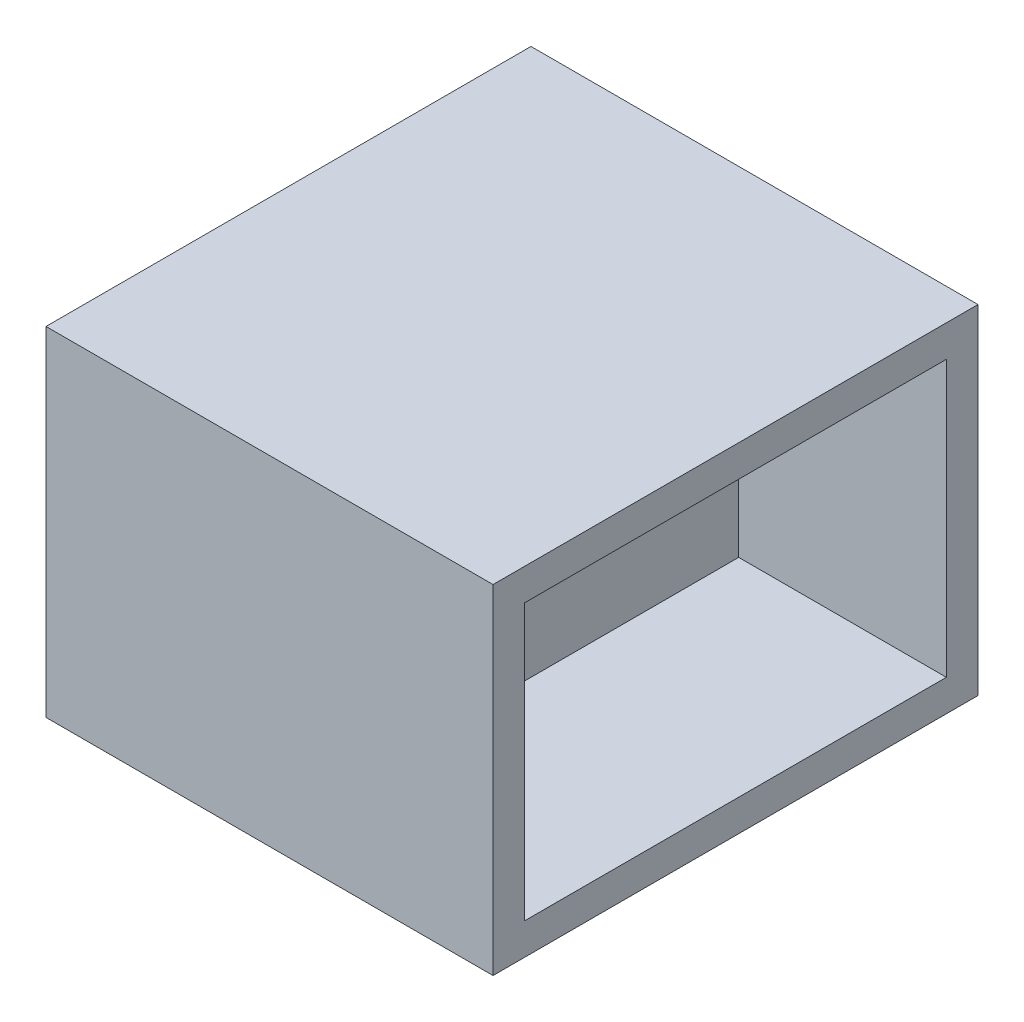
ISO-10303-21;
HEADER;
FILE_DESCRIPTION(('STEP AP214'),'2;1');
FILE_NAME('part.step','',(''),(''),'','','');
FILE_SCHEMA(('AUTOMOTIVE_DESIGN { 1 0 10303 214 1 1 1 1 }'));
ENDSEC;
DATA;
#1=APPLICATION_CONTEXT('core data for automotive mechanical design processes');
#2=APPLICATION_PROTOCOL_DEFINITION('international standard','automotive_design',2000,#1);
#3=PRODUCT_CONTEXT('',#1,'mechanical');
#4=PRODUCT('Part','Part','',(#3));
#5=PRODUCT_RELATED_PRODUCT_CATEGORY('part','',(#4));
#6=PRODUCT_DEFINITION_FORMATION('','',#4);
#7=PRODUCT_DEFINITION_CONTEXT('part definition',#1,'design');
#8=PRODUCT_DEFINITION('design','',#6,#7);
#9=PRODUCT_DEFINITION_SHAPE('','',#8);
#10=(LENGTH_UNIT() NAMED_UNIT(*) SI_UNIT(.MILLI.,.METRE.));
#11=(NAMED_UNIT(*) PLANE_ANGLE_UNIT() SI_UNIT($,.RADIAN.));
#12=(NAMED_UNIT(*) SI_UNIT($,.STERADIAN.) SOLID_ANGLE_UNIT());
#13=UNCERTAINTY_MEASURE_WITH_UNIT(LENGTH_MEASURE(1.E-05),#10,'distance_accuracy_value','');
#14=(GEOMETRIC_REPRESENTATION_CONTEXT(3) GLOBAL_UNCERTAINTY_ASSIGNED_CONTEXT((#13)) GLOBAL_UNIT_ASSIGNED_CONTEXT((#10,
#11,#12)) REPRESENTATION_CONTEXT('',''));
#15=CARTESIAN_POINT('',(0.,0.,0.));
#16=DIRECTION('',(0.,0.,1.));
#17=DIRECTION('',(1.,0.,0.));
#18=AXIS2_PLACEMENT_3D('',#15,#16,#17);
#19=CARTESIAN_POINT('',(0.,0.,3.));
#20=DIRECTION('',(0.,0.,-1.));
#21=DIRECTION('',(-1.,0.,0.));
#22=AXIS2_PLACEMENT_3D('',#19,#20,#21);
#23=PLANE('',#22);
#24=DIRECTION('',(0.,-1.,0.));
#25=VECTOR('',#24,1.);
#26=CARTESIAN_POINT('',(-21.2,-16.06,3.));
#27=LINE('',#26,#25);
#28=CARTESIAN_POINT('',(-21.2,13.06,3.));
#29=VERTEX_POINT('',#28);
#30=CARTESIAN_POINT('',(-21.2,-13.06,3.));
#31=VERTEX_POINT('',#30);
#32=EDGE_CURVE('E214',#29,#31,#27,.T.);
#33=ORIENTED_EDGE('',*,*,#32,.T.);
#34=DIRECTION('',(1.,0.,0.));
#35=VECTOR('',#34,1.);
#36=CARTESIAN_POINT('',(-21.2,-13.06,3.));
#37=LINE('',#36,#35);
#38=CARTESIAN_POINT('',(-1.5,-13.06,3.));
#39=VERTEX_POINT('',#38);
#40=EDGE_CURVE('E54',#31,#39,#37,.T.);
#41=ORIENTED_EDGE('',*,*,#40,.T.);
#42=DIRECTION('',(0.,1.,0.));
#43=VECTOR('',#42,1.);
#44=CARTESIAN_POINT('',(-1.5,0.,3.));
#45=LINE('',#44,#43);
#46=CARTESIAN_POINT('',(-1.5,13.06,3.));
#47=VERTEX_POINT('',#46);
#48=EDGE_CURVE('E58',#39,#47,#45,.T.);
#49=ORIENTED_EDGE('',*,*,#48,.T.);
#50=DIRECTION('',(1.,0.,0.));
#51=VECTOR('',#50,1.);
#52=CARTESIAN_POINT('',(0.,13.06,3.));
#53=LINE('',#52,#51);
#54=EDGE_CURVE('E181',#29,#47,#53,.T.);
#55=ORIENTED_EDGE('',*,*,#54,.F.);
#56=EDGE_LOOP('',(#33,#41,#49,#55));
#57=FACE_BOUND('',#56,.T.);
#58=ADVANCED_FACE('F37',(#57),#23,.F.);
#59=CARTESIAN_POINT('',(21.2,-16.06,3.));
#60=DIRECTION('',(-1.,0.,0.));
#61=DIRECTION('',(0.,0.,1.));
#62=AXIS2_PLACEMENT_3D('',#59,#60,#61);
#63=PLANE('',#62);
#64=DIRECTION('',(0.,0.,-1.));
#65=VECTOR('',#64,1.);
#66=CARTESIAN_POINT('',(21.2,-13.06,43.));
#67=LINE('',#66,#65);
#68=CARTESIAN_POINT('',(21.2,-13.06,43.));
#69=VERTEX_POINT('',#68);
#70=CARTESIAN_POINT('',(21.2,-13.06,3.));
#71=VERTEX_POINT('',#70);
#72=EDGE_CURVE('E178',#69,#71,#67,.T.);
#73=ORIENTED_EDGE('',*,*,#72,.F.);
#74=DIRECTION('',(0.,1.,0.));
#75=VECTOR('',#74,1.);
#76=CARTESIAN_POINT('',(21.2,-16.06,43.));
#77=LINE('',#76,#75);
#78=CARTESIAN_POINT('',(21.2,13.06,43.));
#79=VERTEX_POINT('',#78);
#80=EDGE_CURVE('E153',#69,#79,#77,.T.);
#81=ORIENTED_EDGE('',*,*,#80,.T.);
#82=DIRECTION('',(0.,0.,-1.));
#83=VECTOR('',#82,1.);
#84=CARTESIAN_POINT('',(21.2,13.06,43.));
#85=LINE('',#84,#83);
#86=CARTESIAN_POINT('',(21.2,13.06,3.));
#87=VERTEX_POINT('',#86);
#88=EDGE_CURVE('E193',#79,#87,#85,.T.);
#89=ORIENTED_EDGE('',*,*,#88,.T.);
#90=DIRECTION('',(0.,1.,0.));
#91=VECTOR('',#90,1.);
#92=CARTESIAN_POINT('',(21.2,-16.06,3.));
#93=LINE('',#92,#91);
#94=EDGE_CURVE('E213',#71,#87,#93,.T.);
#95=ORIENTED_EDGE('',*,*,#94,.F.);
#96=EDGE_LOOP('',(#73,#81,#89,#95));
#97=FACE_BOUND('',#96,.T.);
#98=DIRECTION('',(0.,1.,0.));
#99=VECTOR('',#98,1.);
#100=CARTESIAN_POINT('',(21.2,-16.06,0.));
#101=LINE('',#100,#99);
#102=CARTESIAN_POINT('',(21.2,-16.06,0.));
#103=VERTEX_POINT('',#102);
#104=CARTESIAN_POINT('',(21.2,16.06,0.));
#105=VERTEX_POINT('',#104);
#106=EDGE_CURVE('E205',#103,#105,#101,.T.);
#107=ORIENTED_EDGE('',*,*,#106,.T.);
#108=DIRECTION('',(0.,0.,-1.));
#109=VECTOR('',#108,1.);
#110=CARTESIAN_POINT('',(21.2,16.06,3.));
#111=LINE('',#110,#109);
#112=CARTESIAN_POINT('',(21.2,16.06,46.));
#113=VERTEX_POINT('',#112);
#114=EDGE_CURVE('E11',#113,#105,#111,.T.);
#115=ORIENTED_EDGE('',*,*,#114,.F.);
#116=DIRECTION('',(0.,1.,0.));
#117=VECTOR('',#116,1.);
#118=CARTESIAN_POINT('',(21.2,-16.06,46.));
#119=LINE('',#118,#117);
#120=CARTESIAN_POINT('',(21.2,-16.06,46.));
#121=VERTEX_POINT('',#120);
#122=EDGE_CURVE('E150',#121,#113,#119,.T.);
#123=ORIENTED_EDGE('',*,*,#122,.F.);
#124=DIRECTION('',(0.,0.,-1.));
#125=VECTOR('',#124,1.);
#126=CARTESIAN_POINT('',(21.2,-16.06,3.));
#127=LINE('',#126,#125);
#128=EDGE_CURVE('E138',#121,#103,#127,.T.);
#129=ORIENTED_EDGE('',*,*,#128,.T.);
#130=EDGE_LOOP('',(#107,#115,#123,#129));
#131=FACE_BOUND('',#130,.T.);
#132=ADVANCED_FACE('F45',(#97,#131),#63,.F.);
#133=CARTESIAN_POINT('',(-21.2,16.06,3.));
#134=DIRECTION('',(0.,-1.,0.));
#135=DIRECTION('',(0.,0.,-1.));
#136=AXIS2_PLACEMENT_3D('',#133,#134,#135);
#137=PLANE('',#136);
#138=DIRECTION('',(-1.,0.,0.));
#139=VECTOR('',#138,1.);
#140=CARTESIAN_POINT('',(-21.2,16.06,0.));
#141=LINE('',#140,#139);
#142=CARTESIAN_POINT('',(-21.2,16.06,0.));
#143=VERTEX_POINT('',#142);
#144=EDGE_CURVE('E219',#105,#143,#141,.T.);
#145=ORIENTED_EDGE('',*,*,#144,.T.);
#146=DIRECTION('',(0.,0.,-1.));
#147=VECTOR('',#146,1.);
#148=CARTESIAN_POINT('',(-21.2,16.06,3.));
#149=LINE('',#148,#147);
#150=CARTESIAN_POINT('',(-21.2,16.06,46.));
#151=VERTEX_POINT('',#150);
#152=EDGE_CURVE('E48',#151,#143,#149,.T.);
#153=ORIENTED_EDGE('',*,*,#152,.F.);
#154=DIRECTION('',(-1.,0.,0.));
#155=VECTOR('',#154,1.);
#156=CARTESIAN_POINT('',(-21.2,16.06,46.));
#157=LINE('',#156,#155);
#158=EDGE_CURVE('E155',#113,#151,#157,.T.);
#159=ORIENTED_EDGE('',*,*,#158,.F.);
#160=ORIENTED_EDGE('',*,*,#114,.T.);
#161=EDGE_LOOP('',(#145,#153,#159,#160));
#162=FACE_BOUND('',#161,.T.);
#163=ADVANCED_FACE('F230',(#162),#137,.F.);
#164=CARTESIAN_POINT('',(-21.2,-16.06,3.));
#165=DIRECTION('',(1.,0.,0.));
#166=DIRECTION('',(0.,0.,-1.));
#167=AXIS2_PLACEMENT_3D('',#164,#165,#166);
#168=PLANE('',#167);
#169=DIRECTION('',(0.,-1.,0.));
#170=VECTOR('',#169,1.);
#171=CARTESIAN_POINT('',(-21.2,-16.06,43.));
#172=LINE('',#171,#170);
#173=CARTESIAN_POINT('',(-21.2,13.06,43.));
#174=VERTEX_POINT('',#173);
#175=CARTESIAN_POINT('',(-21.2,-13.06,43.));
#176=VERTEX_POINT('',#175);
#177=EDGE_CURVE('E156',#174,#176,#172,.T.);
#178=ORIENTED_EDGE('',*,*,#177,.T.);
#179=DIRECTION('',(0.,0.,-1.));
#180=VECTOR('',#179,1.);
#181=CARTESIAN_POINT('',(-21.2,-13.06,43.));
#182=LINE('',#181,#180);
#183=EDGE_CURVE('E206',#176,#31,#182,.T.);
#184=ORIENTED_EDGE('',*,*,#183,.T.);
#185=ORIENTED_EDGE('',*,*,#32,.F.);
#186=DIRECTION('',(0.,0.,-1.));
#187=VECTOR('',#186,1.);
#188=CARTESIAN_POINT('',(-21.2,13.06,43.));
#189=LINE('',#188,#187);
#190=EDGE_CURVE('E186',#174,#29,#189,.T.);
#191=ORIENTED_EDGE('',*,*,#190,.F.);
#192=EDGE_LOOP('',(#178,#184,#185,#191));
#193=FACE_BOUND('',#192,.T.);
#194=DIRECTION('',(0.,-1.,0.));
#195=VECTOR('',#194,1.);
#196=CARTESIAN_POINT('',(-21.2,-16.06,0.));
#197=LINE('',#196,#195);
#198=CARTESIAN_POINT('',(-21.2,-16.06,0.));
#199=VERTEX_POINT('',#198);
#200=EDGE_CURVE('E131',#143,#199,#197,.T.);
#201=ORIENTED_EDGE('',*,*,#200,.T.);
#202=DIRECTION('',(0.,0.,-1.));
#203=VECTOR('',#202,1.);
#204=CARTESIAN_POINT('',(-21.2,-16.06,3.));
#205=LINE('',#204,#203);
#206=CARTESIAN_POINT('',(-21.2,-16.06,46.));
#207=VERTEX_POINT('',#206);
#208=EDGE_CURVE('E126',#207,#199,#205,.T.);
#209=ORIENTED_EDGE('',*,*,#208,.F.);
#210=DIRECTION('',(0.,-1.,0.));
#211=VECTOR('',#210,1.);
#212=CARTESIAN_POINT('',(-21.2,-16.06,46.));
#213=LINE('',#212,#211);
#214=EDGE_CURVE('E132',#151,#207,#213,.T.);
#215=ORIENTED_EDGE('',*,*,#214,.F.);
#216=ORIENTED_EDGE('',*,*,#152,.T.);
#217=EDGE_LOOP('',(#201,#209,#215,#216));
#218=FACE_BOUND('',#217,.T.);
#219=ADVANCED_FACE('F128',(#193,#218),#168,.F.);
#220=CARTESIAN_POINT('',(-21.2,-16.06,3.));
#221=DIRECTION('',(0.,1.,0.));
#222=DIRECTION('',(-1.,0.,0.));
#223=AXIS2_PLACEMENT_3D('',#220,#221,#222);
#224=PLANE('',#223);
#225=DIRECTION('',(1.,0.,0.));
#226=VECTOR('',#225,1.);
#227=CARTESIAN_POINT('',(-21.2,-16.06,0.));
#228=LINE('',#227,#226);
#229=EDGE_CURVE('E216',#199,#103,#228,.T.);
#230=ORIENTED_EDGE('',*,*,#229,.T.);
#231=ORIENTED_EDGE('',*,*,#128,.F.);
#232=DIRECTION('',(1.,0.,0.));
#233=VECTOR('',#232,1.);
#234=CARTESIAN_POINT('',(-21.2,-16.06,46.));
#235=LINE('',#234,#233);
#236=EDGE_CURVE('E143',#207,#121,#235,.T.);
#237=ORIENTED_EDGE('',*,*,#236,.F.);
#238=ORIENTED_EDGE('',*,*,#208,.T.);
#239=EDGE_LOOP('',(#230,#231,#237,#238));
#240=FACE_BOUND('',#239,.T.);
#241=ADVANCED_FACE('F142',(#240),#224,.F.);
#242=DIRECTION('',(0.,1.,0.));
#243=VECTOR('',#242,1.);
#244=CARTESIAN_POINT('',(1.5,0.,3.));
#245=LINE('',#244,#243);
#246=CARTESIAN_POINT('',(1.5,-13.06,3.));
#247=VERTEX_POINT('',#246);
#248=CARTESIAN_POINT('',(1.5,13.06,3.));
#249=VERTEX_POINT('',#248);
#250=EDGE_CURVE('E177',#247,#249,#245,.T.);
#251=ORIENTED_EDGE('',*,*,#250,.F.);
#252=EDGE_CURVE('E161',#247,#71,#37,.T.);
#253=ORIENTED_EDGE('',*,*,#252,.T.);
#254=ORIENTED_EDGE('',*,*,#94,.T.);
#255=DIRECTION('',(1.,0.,0.));
#256=VECTOR('',#255,1.);
#257=CARTESIAN_POINT('',(0.,13.06,3.));
#258=LINE('',#257,#256);
#259=EDGE_CURVE('E176',#249,#87,#258,.T.);
#260=ORIENTED_EDGE('',*,*,#259,.F.);
#261=EDGE_LOOP('',(#251,#253,#254,#260));
#262=FACE_BOUND('',#261,.T.);
#263=ADVANCED_FACE('F238',(#262),#23,.F.);
#264=CARTESIAN_POINT('',(0.,0.,0.));
#265=DIRECTION('',(0.,0.,-1.));
#266=DIRECTION('',(-1.,0.,0.));
#267=AXIS2_PLACEMENT_3D('',#264,#265,#266);
#268=PLANE('',#267);
#269=ORIENTED_EDGE('',*,*,#106,.F.);
#270=ORIENTED_EDGE('',*,*,#229,.F.);
#271=ORIENTED_EDGE('',*,*,#200,.F.);
#272=ORIENTED_EDGE('',*,*,#144,.F.);
#273=EDGE_LOOP('',(#269,#270,#271,#272));
#274=FACE_BOUND('',#273,.T.);
#275=ADVANCED_FACE('F229',(#274),#268,.T.);
#276=CARTESIAN_POINT('',(1.5,0.,43.));
#277=DIRECTION('',(-1.,0.,0.));
#278=DIRECTION('',(0.,0.,1.));
#279=AXIS2_PLACEMENT_3D('',#276,#277,#278);
#280=PLANE('',#279);
#281=ORIENTED_EDGE('',*,*,#250,.T.);
#282=DIRECTION('',(0.,0.,-1.));
#283=VECTOR('',#282,1.);
#284=CARTESIAN_POINT('',(1.5,13.06,43.));
#285=LINE('',#284,#283);
#286=CARTESIAN_POINT('',(1.5,13.06,43.));
#287=VERTEX_POINT('',#286);
#288=EDGE_CURVE('E198',#287,#249,#285,.T.);
#289=ORIENTED_EDGE('',*,*,#288,.F.);
#290=DIRECTION('',(0.,1.,0.));
#291=VECTOR('',#290,1.);
#292=CARTESIAN_POINT('',(1.5,0.,43.));
#293=LINE('',#292,#291);
#294=CARTESIAN_POINT('',(1.5,-13.06,43.));
#295=VERTEX_POINT('',#294);
#296=EDGE_CURVE('E163',#295,#287,#293,.T.);
#297=ORIENTED_EDGE('',*,*,#296,.F.);
#298=DIRECTION('',(0.,0.,-1.));
#299=VECTOR('',#298,1.);
#300=CARTESIAN_POINT('',(1.5,-13.06,43.));
#301=LINE('',#300,#299);
#302=EDGE_CURVE('E200',#295,#247,#301,.T.);
#303=ORIENTED_EDGE('',*,*,#302,.T.);
#304=EDGE_LOOP('',(#281,#289,#297,#303));
#305=FACE_BOUND('',#304,.T.);
#306=ADVANCED_FACE('F249',(#305),#280,.F.);
#307=CARTESIAN_POINT('',(0.,13.06,43.));
#308=DIRECTION('',(0.,1.,0.));
#309=DIRECTION('',(0.,0.,1.));
#310=AXIS2_PLACEMENT_3D('',#307,#308,#309);
#311=PLANE('',#310);
#312=ORIENTED_EDGE('',*,*,#259,.T.);
#313=ORIENTED_EDGE('',*,*,#88,.F.);
#314=DIRECTION('',(1.,0.,0.));
#315=VECTOR('',#314,1.);
#316=CARTESIAN_POINT('',(0.,13.06,43.));
#317=LINE('',#316,#315);
#318=EDGE_CURVE('E170',#287,#79,#317,.T.);
#319=ORIENTED_EDGE('',*,*,#318,.F.);
#320=ORIENTED_EDGE('',*,*,#288,.T.);
#321=EDGE_LOOP('',(#312,#313,#319,#320));
#322=FACE_BOUND('',#321,.T.);
#323=ADVANCED_FACE('F266',(#322),#311,.F.);
#324=CARTESIAN_POINT('',(0.,13.06,43.));
#325=DIRECTION('',(0.,1.,0.));
#326=DIRECTION('',(0.,0.,1.));
#327=AXIS2_PLACEMENT_3D('',#324,#325,#326);
#328=PLANE('',#327);
#329=ORIENTED_EDGE('',*,*,#54,.T.);
#330=DIRECTION('',(0.,0.,-1.));
#331=VECTOR('',#330,1.);
#332=CARTESIAN_POINT('',(-1.5,13.06,43.));
#333=LINE('',#332,#331);
#334=CARTESIAN_POINT('',(-1.5,13.06,43.));
#335=VERTEX_POINT('',#334);
#336=EDGE_CURVE('E187',#335,#47,#333,.T.);
#337=ORIENTED_EDGE('',*,*,#336,.F.);
#338=DIRECTION('',(1.,0.,0.));
#339=VECTOR('',#338,1.);
#340=CARTESIAN_POINT('',(0.,13.06,43.));
#341=LINE('',#340,#339);
#342=EDGE_CURVE('E168',#174,#335,#341,.T.);
#343=ORIENTED_EDGE('',*,*,#342,.F.);
#344=ORIENTED_EDGE('',*,*,#190,.T.);
#345=EDGE_LOOP('',(#329,#337,#343,#344));
#346=FACE_BOUND('',#345,.T.);
#347=ADVANCED_FACE('F268',(#346),#328,.F.);
#348=CARTESIAN_POINT('',(-1.5,0.,43.));
#349=DIRECTION('',(-1.,0.,0.));
#350=DIRECTION('',(0.,0.,1.));
#351=AXIS2_PLACEMENT_3D('',#348,#349,#350);
#352=PLANE('',#351);
#353=ORIENTED_EDGE('',*,*,#48,.F.);
#354=DIRECTION('',(0.,0.,-1.));
#355=VECTOR('',#354,1.);
#356=CARTESIAN_POINT('',(-1.5,-13.06,43.));
#357=LINE('',#356,#355);
#358=CARTESIAN_POINT('',(-1.5,-13.06,43.));
#359=VERTEX_POINT('',#358);
#360=EDGE_CURVE('E171',#359,#39,#357,.T.);
#361=ORIENTED_EDGE('',*,*,#360,.F.);
#362=DIRECTION('',(0.,1.,0.));
#363=VECTOR('',#362,1.);
#364=CARTESIAN_POINT('',(-1.5,0.,43.));
#365=LINE('',#364,#363);
#366=EDGE_CURVE('E172',#359,#335,#365,.T.);
#367=ORIENTED_EDGE('',*,*,#366,.T.);
#368=ORIENTED_EDGE('',*,*,#336,.T.);
#369=EDGE_LOOP('',(#353,#361,#367,#368));
#370=FACE_BOUND('',#369,.T.);
#371=ADVANCED_FACE('F273',(#370),#352,.T.);
#372=CARTESIAN_POINT('',(-21.2,-13.06,43.));
#373=DIRECTION('',(0.,1.,0.));
#374=DIRECTION('',(0.,0.,1.));
#375=AXIS2_PLACEMENT_3D('',#372,#373,#374);
#376=PLANE('',#375);
#377=DIRECTION('',(1.,0.,0.));
#378=VECTOR('',#377,1.);
#379=CARTESIAN_POINT('',(-21.2,-13.06,43.));
#380=LINE('',#379,#378);
#381=EDGE_CURVE('E201',#176,#359,#380,.T.);
#382=ORIENTED_EDGE('',*,*,#381,.T.);
#383=ORIENTED_EDGE('',*,*,#360,.T.);
#384=ORIENTED_EDGE('',*,*,#40,.F.);
#385=ORIENTED_EDGE('',*,*,#183,.F.);
#386=EDGE_LOOP('',(#382,#383,#384,#385));
#387=FACE_BOUND('',#386,.T.);
#388=ADVANCED_FACE('F279',(#387),#376,.T.);
#389=ORIENTED_EDGE('',*,*,#302,.F.);
#390=EDGE_CURVE('E210',#295,#69,#380,.T.);
#391=ORIENTED_EDGE('',*,*,#390,.T.);
#392=ORIENTED_EDGE('',*,*,#72,.T.);
#393=ORIENTED_EDGE('',*,*,#252,.F.);
#394=EDGE_LOOP('',(#389,#391,#392,#393));
#395=FACE_BOUND('',#394,.T.);
#396=ADVANCED_FACE('F253',(#395),#376,.T.);
#397=CARTESIAN_POINT('',(0.,0.,43.));
#398=DIRECTION('',(0.,0.,-1.));
#399=DIRECTION('',(-1.,0.,0.));
#400=AXIS2_PLACEMENT_3D('',#397,#398,#399);
#401=PLANE('',#400);
#402=ORIENTED_EDGE('',*,*,#390,.F.);
#403=ORIENTED_EDGE('',*,*,#296,.T.);
#404=ORIENTED_EDGE('',*,*,#318,.T.);
#405=ORIENTED_EDGE('',*,*,#80,.F.);
#406=EDGE_LOOP('',(#402,#403,#404,#405));
#407=FACE_BOUND('',#406,.T.);
#408=ADVANCED_FACE('F263',(#407),#401,.T.);
#409=ORIENTED_EDGE('',*,*,#381,.F.);
#410=ORIENTED_EDGE('',*,*,#177,.F.);
#411=ORIENTED_EDGE('',*,*,#342,.T.);
#412=ORIENTED_EDGE('',*,*,#366,.F.);
#413=EDGE_LOOP('',(#409,#410,#411,#412));
#414=FACE_BOUND('',#413,.T.);
#415=ADVANCED_FACE('F292',(#414),#401,.T.);
#416=CARTESIAN_POINT('',(0.,0.,46.));
#417=DIRECTION('',(0.,0.,-1.));
#418=DIRECTION('',(-1.,0.,0.));
#419=AXIS2_PLACEMENT_3D('',#416,#417,#418);
#420=PLANE('',#419);
#421=ORIENTED_EDGE('',*,*,#214,.T.);
#422=ORIENTED_EDGE('',*,*,#236,.T.);
#423=ORIENTED_EDGE('',*,*,#122,.T.);
#424=ORIENTED_EDGE('',*,*,#158,.T.);
#425=EDGE_LOOP('',(#421,#422,#423,#424));
#426=FACE_BOUND('',#425,.T.);
#427=ADVANCED_FACE('F147',(#426),#420,.F.);
#428=CLOSED_SHELL('',(#58,#132,#163,#219,#241,#263,#275,#306,#323,#347,#371,#388,#396,#408,#415,#427));
#429=MANIFOLD_SOLID_BREP('B2',#428);
#430=ADVANCED_BREP_SHAPE_REPRESENTATION('',(#18,#429),#14);
#431=SHAPE_DEFINITION_REPRESENTATION(#9,#430);
ENDSEC;
END-ISO-10303-21;
